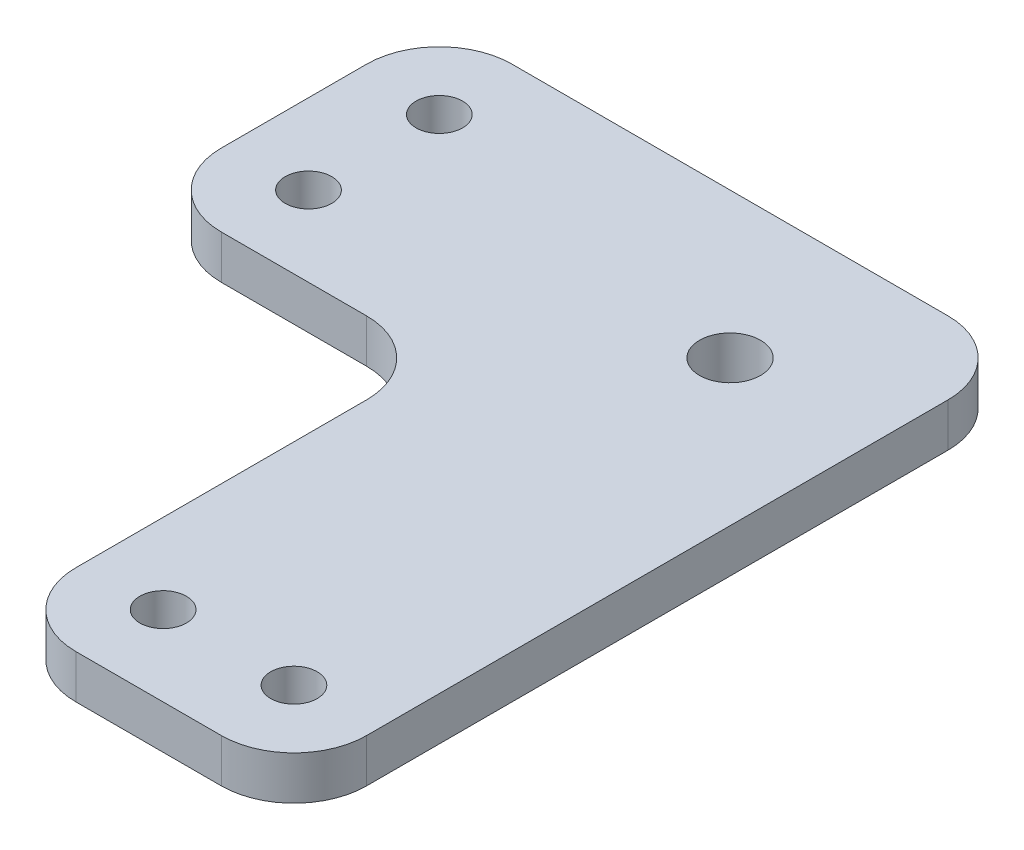
ISO-10303-21;
HEADER;
FILE_DESCRIPTION(('STEP AP214'),'2;1');
FILE_NAME('part.step','',(''),(''),'','','');
FILE_SCHEMA(('AUTOMOTIVE_DESIGN { 1 0 10303 214 1 1 1 1 }'));
ENDSEC;
DATA;
#1=APPLICATION_CONTEXT('core data for automotive mechanical design processes');
#2=APPLICATION_PROTOCOL_DEFINITION('international standard','automotive_design',2000,#1);
#3=PRODUCT_CONTEXT('',#1,'mechanical');
#4=PRODUCT('Part','Part','',(#3));
#5=PRODUCT_RELATED_PRODUCT_CATEGORY('part','',(#4));
#6=PRODUCT_DEFINITION_FORMATION('','',#4);
#7=PRODUCT_DEFINITION_CONTEXT('part definition',#1,'design');
#8=PRODUCT_DEFINITION('design','',#6,#7);
#9=PRODUCT_DEFINITION_SHAPE('','',#8);
#10=(LENGTH_UNIT() NAMED_UNIT(*) SI_UNIT(.MILLI.,.METRE.));
#11=(NAMED_UNIT(*) PLANE_ANGLE_UNIT() SI_UNIT($,.RADIAN.));
#12=(NAMED_UNIT(*) SI_UNIT($,.STERADIAN.) SOLID_ANGLE_UNIT());
#13=UNCERTAINTY_MEASURE_WITH_UNIT(LENGTH_MEASURE(1.E-05),#10,'distance_accuracy_value','');
#14=(GEOMETRIC_REPRESENTATION_CONTEXT(3) GLOBAL_UNCERTAINTY_ASSIGNED_CONTEXT((#13)) GLOBAL_UNIT_ASSIGNED_CONTEXT((#10,
#11,#12)) REPRESENTATION_CONTEXT('',''));
#15=CARTESIAN_POINT('',(0.,0.,0.));
#16=DIRECTION('',(0.,0.,1.));
#17=DIRECTION('',(1.,0.,0.));
#18=AXIS2_PLACEMENT_3D('',#15,#16,#17);
#19=CARTESIAN_POINT('',(10.,3.,15.));
#20=DIRECTION('',(-1.,0.,0.));
#21=DIRECTION('',(0.,0.,1.));
#22=AXIS2_PLACEMENT_3D('',#19,#20,#21);
#23=PLANE('',#22);
#24=DIRECTION('',(0.,0.,-1.));
#25=VECTOR('',#24,1.);
#26=CARTESIAN_POINT('',(10.,0.,15.));
#27=LINE('',#26,#25);
#28=CARTESIAN_POINT('',(10.,0.,10.));
#29=VERTEX_POINT('',#28);
#30=CARTESIAN_POINT('',(10.,0.,-30.));
#31=VERTEX_POINT('',#30);
#32=EDGE_CURVE('E159',#29,#31,#27,.T.);
#33=ORIENTED_EDGE('',*,*,#32,.T.);
#34=DIRECTION('',(0.,-1.,0.));
#35=VECTOR('',#34,1.);
#36=CARTESIAN_POINT('',(10.,3.,-30.));
#37=LINE('',#36,#35);
#38=CARTESIAN_POINT('',(10.,3.,-30.));
#39=VERTEX_POINT('',#38);
#40=EDGE_CURVE('E134',#31,#39,#37,.F.);
#41=ORIENTED_EDGE('',*,*,#40,.T.);
#42=DIRECTION('',(0.,0.,-1.));
#43=VECTOR('',#42,1.);
#44=CARTESIAN_POINT('',(10.,3.,15.));
#45=LINE('',#44,#43);
#46=CARTESIAN_POINT('',(10.,3.,10.));
#47=VERTEX_POINT('',#46);
#48=EDGE_CURVE('E180',#47,#39,#45,.T.);
#49=ORIENTED_EDGE('',*,*,#48,.F.);
#50=DIRECTION('',(0.,-1.,0.));
#51=VECTOR('',#50,1.);
#52=CARTESIAN_POINT('',(10.,3.,10.));
#53=LINE('',#52,#51);
#54=EDGE_CURVE('E140',#47,#29,#53,.T.);
#55=ORIENTED_EDGE('',*,*,#54,.T.);
#56=EDGE_LOOP('',(#33,#41,#49,#55));
#57=FACE_BOUND('',#56,.T.);
#58=ADVANCED_FACE('F38',(#57),#23,.F.);
#59=CARTESIAN_POINT('',(10.,3.,-35.));
#60=DIRECTION('',(0.,0.,1.));
#61=DIRECTION('',(1.,0.,0.));
#62=AXIS2_PLACEMENT_3D('',#59,#60,#61);
#63=PLANE('',#62);
#64=DIRECTION('',(-1.,0.,0.));
#65=VECTOR('',#64,1.);
#66=CARTESIAN_POINT('',(10.,3.,-35.));
#67=LINE('',#66,#65);
#68=CARTESIAN_POINT('',(5.,3.,-35.));
#69=VERTEX_POINT('',#68);
#70=CARTESIAN_POINT('',(-25.,3.,-35.));
#71=VERTEX_POINT('',#70);
#72=EDGE_CURVE('E150',#69,#71,#67,.T.);
#73=ORIENTED_EDGE('',*,*,#72,.F.);
#74=DIRECTION('',(0.,-1.,0.));
#75=VECTOR('',#74,1.);
#76=CARTESIAN_POINT('',(5.,3.,-35.));
#77=LINE('',#76,#75);
#78=CARTESIAN_POINT('',(5.,0.,-35.));
#79=VERTEX_POINT('',#78);
#80=EDGE_CURVE('E133',#69,#79,#77,.T.);
#81=ORIENTED_EDGE('',*,*,#80,.T.);
#82=DIRECTION('',(-1.,0.,0.));
#83=VECTOR('',#82,1.);
#84=CARTESIAN_POINT('',(10.,0.,-35.));
#85=LINE('',#84,#83);
#86=CARTESIAN_POINT('',(-25.,0.,-35.));
#87=VERTEX_POINT('',#86);
#88=EDGE_CURVE('E147',#79,#87,#85,.T.);
#89=ORIENTED_EDGE('',*,*,#88,.T.);
#90=DIRECTION('',(0.,-1.,0.));
#91=VECTOR('',#90,1.);
#92=CARTESIAN_POINT('',(-25.,3.,-35.));
#93=LINE('',#92,#91);
#94=EDGE_CURVE('E153',#87,#71,#93,.F.);
#95=ORIENTED_EDGE('',*,*,#94,.T.);
#96=EDGE_LOOP('',(#73,#81,#89,#95));
#97=FACE_BOUND('',#96,.T.);
#98=ADVANCED_FACE('F146',(#97),#63,.F.);
#99=CARTESIAN_POINT('',(-30.,3.,-35.));
#100=DIRECTION('',(1.,0.,0.));
#101=DIRECTION('',(0.,0.,-1.));
#102=AXIS2_PLACEMENT_3D('',#99,#100,#101);
#103=PLANE('',#102);
#104=DIRECTION('',(0.,0.,1.));
#105=VECTOR('',#104,1.);
#106=CARTESIAN_POINT('',(-30.,3.,-35.));
#107=LINE('',#106,#105);
#108=CARTESIAN_POINT('',(-30.,3.,-30.));
#109=VERTEX_POINT('',#108);
#110=CARTESIAN_POINT('',(-30.,3.,-20.));
#111=VERTEX_POINT('',#110);
#112=EDGE_CURVE('E264',#109,#111,#107,.T.);
#113=ORIENTED_EDGE('',*,*,#112,.F.);
#114=DIRECTION('',(0.,-1.,0.));
#115=VECTOR('',#114,1.);
#116=CARTESIAN_POINT('',(-30.,3.,-30.));
#117=LINE('',#116,#115);
#118=CARTESIAN_POINT('',(-30.,0.,-30.));
#119=VERTEX_POINT('',#118);
#120=EDGE_CURVE('E216',#109,#119,#117,.T.);
#121=ORIENTED_EDGE('',*,*,#120,.T.);
#122=DIRECTION('',(0.,0.,1.));
#123=VECTOR('',#122,1.);
#124=CARTESIAN_POINT('',(-30.,0.,-35.));
#125=LINE('',#124,#123);
#126=CARTESIAN_POINT('',(-30.,0.,-20.));
#127=VERTEX_POINT('',#126);
#128=EDGE_CURVE('E158',#119,#127,#125,.T.);
#129=ORIENTED_EDGE('',*,*,#128,.T.);
#130=DIRECTION('',(0.,-1.,0.));
#131=VECTOR('',#130,1.);
#132=CARTESIAN_POINT('',(-30.,3.,-20.));
#133=LINE('',#132,#131);
#134=EDGE_CURVE('E213',#127,#111,#133,.F.);
#135=ORIENTED_EDGE('',*,*,#134,.T.);
#136=EDGE_LOOP('',(#113,#121,#129,#135));
#137=FACE_BOUND('',#136,.T.);
#138=ADVANCED_FACE('F355',(#137),#103,.F.);
#139=CARTESIAN_POINT('',(-30.,3.,-15.));
#140=DIRECTION('',(0.,0.,-1.));
#141=DIRECTION('',(-1.,0.,0.));
#142=AXIS2_PLACEMENT_3D('',#139,#140,#141);
#143=PLANE('',#142);
#144=DIRECTION('',(1.,0.,0.));
#145=VECTOR('',#144,1.);
#146=CARTESIAN_POINT('',(-30.,0.,-15.));
#147=LINE('',#146,#145);
#148=CARTESIAN_POINT('',(-25.,0.,-15.));
#149=VERTEX_POINT('',#148);
#150=CARTESIAN_POINT('',(-15.,0.,-15.));
#151=VERTEX_POINT('',#150);
#152=EDGE_CURVE('E164',#149,#151,#147,.T.);
#153=ORIENTED_EDGE('',*,*,#152,.T.);
#154=DIRECTION('',(0.,-1.,0.));
#155=VECTOR('',#154,1.);
#156=CARTESIAN_POINT('',(-15.,3.,-15.));
#157=LINE('',#156,#155);
#158=CARTESIAN_POINT('',(-15.,3.,-15.));
#159=VERTEX_POINT('',#158);
#160=EDGE_CURVE('E237',#151,#159,#157,.F.);
#161=ORIENTED_EDGE('',*,*,#160,.T.);
#162=DIRECTION('',(1.,0.,0.));
#163=VECTOR('',#162,1.);
#164=CARTESIAN_POINT('',(-30.,3.,-15.));
#165=LINE('',#164,#163);
#166=CARTESIAN_POINT('',(-25.,3.,-15.));
#167=VERTEX_POINT('',#166);
#168=EDGE_CURVE('E256',#167,#159,#165,.T.);
#169=ORIENTED_EDGE('',*,*,#168,.F.);
#170=DIRECTION('',(0.,-1.,0.));
#171=VECTOR('',#170,1.);
#172=CARTESIAN_POINT('',(-25.,3.,-15.));
#173=LINE('',#172,#171);
#174=EDGE_CURVE('E233',#167,#149,#173,.T.);
#175=ORIENTED_EDGE('',*,*,#174,.T.);
#176=EDGE_LOOP('',(#153,#161,#169,#175));
#177=FACE_BOUND('',#176,.T.);
#178=ADVANCED_FACE('F246',(#177),#143,.F.);
#179=CARTESIAN_POINT('',(-10.,3.,-15.));
#180=DIRECTION('',(1.,0.,0.));
#181=DIRECTION('',(0.,0.,-1.));
#182=AXIS2_PLACEMENT_3D('',#179,#180,#181);
#183=PLANE('',#182);
#184=DIRECTION('',(0.,0.,1.));
#185=VECTOR('',#184,1.);
#186=CARTESIAN_POINT('',(-10.,0.,-15.));
#187=LINE('',#186,#185);
#188=CARTESIAN_POINT('',(-10.,0.,-10.));
#189=VERTEX_POINT('',#188);
#190=CARTESIAN_POINT('',(-10.,0.,10.));
#191=VERTEX_POINT('',#190);
#192=EDGE_CURVE('E173',#189,#191,#187,.T.);
#193=ORIENTED_EDGE('',*,*,#192,.T.);
#194=DIRECTION('',(0.,-1.,0.));
#195=VECTOR('',#194,1.);
#196=CARTESIAN_POINT('',(-10.,3.,10.));
#197=LINE('',#196,#195);
#198=CARTESIAN_POINT('',(-10.,3.,10.));
#199=VERTEX_POINT('',#198);
#200=EDGE_CURVE('E230',#191,#199,#197,.F.);
#201=ORIENTED_EDGE('',*,*,#200,.T.);
#202=DIRECTION('',(0.,0.,1.));
#203=VECTOR('',#202,1.);
#204=CARTESIAN_POINT('',(-10.,3.,-15.));
#205=LINE('',#204,#203);
#206=CARTESIAN_POINT('',(-10.,3.,-10.));
#207=VERTEX_POINT('',#206);
#208=EDGE_CURVE('E255',#207,#199,#205,.T.);
#209=ORIENTED_EDGE('',*,*,#208,.F.);
#210=DIRECTION('',(0.,-1.,0.));
#211=VECTOR('',#210,1.);
#212=CARTESIAN_POINT('',(-10.,0.,-10.));
#213=LINE('',#212,#211);
#214=EDGE_CURVE('E226',#207,#189,#213,.T.);
#215=ORIENTED_EDGE('',*,*,#214,.T.);
#216=EDGE_LOOP('',(#193,#201,#209,#215));
#217=FACE_BOUND('',#216,.T.);
#218=ADVANCED_FACE('F258',(#217),#183,.F.);
#219=CARTESIAN_POINT('',(-10.,3.,15.));
#220=DIRECTION('',(0.,0.,-1.));
#221=DIRECTION('',(-1.,0.,0.));
#222=AXIS2_PLACEMENT_3D('',#219,#220,#221);
#223=PLANE('',#222);
#224=DIRECTION('',(1.,0.,0.));
#225=VECTOR('',#224,1.);
#226=CARTESIAN_POINT('',(-10.,0.,15.));
#227=LINE('',#226,#225);
#228=CARTESIAN_POINT('',(-5.,0.,15.));
#229=VERTEX_POINT('',#228);
#230=CARTESIAN_POINT('',(5.,0.,15.));
#231=VERTEX_POINT('',#230);
#232=EDGE_CURVE('E177',#229,#231,#227,.T.);
#233=ORIENTED_EDGE('',*,*,#232,.T.);
#234=DIRECTION('',(0.,-1.,0.));
#235=VECTOR('',#234,1.);
#236=CARTESIAN_POINT('',(5.,3.,15.));
#237=LINE('',#236,#235);
#238=CARTESIAN_POINT('',(5.,3.,15.));
#239=VERTEX_POINT('',#238);
#240=EDGE_CURVE('E54',#231,#239,#237,.F.);
#241=ORIENTED_EDGE('',*,*,#240,.T.);
#242=DIRECTION('',(1.,0.,0.));
#243=VECTOR('',#242,1.);
#244=CARTESIAN_POINT('',(-10.,3.,15.));
#245=LINE('',#244,#243);
#246=CARTESIAN_POINT('',(-5.,3.,15.));
#247=VERTEX_POINT('',#246);
#248=EDGE_CURVE('E182',#247,#239,#245,.T.);
#249=ORIENTED_EDGE('',*,*,#248,.F.);
#250=DIRECTION('',(0.,-1.,0.));
#251=VECTOR('',#250,1.);
#252=CARTESIAN_POINT('',(-5.,3.,15.));
#253=LINE('',#252,#251);
#254=EDGE_CURVE('E220',#247,#229,#253,.T.);
#255=ORIENTED_EDGE('',*,*,#254,.T.);
#256=EDGE_LOOP('',(#233,#241,#249,#255));
#257=FACE_BOUND('',#256,.T.);
#258=ADVANCED_FACE('F324',(#257),#223,.F.);
#259=CARTESIAN_POINT('',(0.,3.,0.));
#260=DIRECTION('',(0.,1.,0.));
#261=DIRECTION('',(0.,0.,1.));
#262=AXIS2_PLACEMENT_3D('',#259,#260,#261);
#263=PLANE('',#262);
#264=CARTESIAN_POINT('',(0.,3.,-25.));
#265=DIRECTION('',(0.,1.,0.));
#266=DIRECTION('',(0.,0.,1.));
#267=AXIS2_PLACEMENT_3D('',#264,#265,#266);
#268=CIRCLE('',#267,2.1);
#269=CARTESIAN_POINT('',(0.,3.,-22.9));
#270=VERTEX_POINT('',#269);
#271=EDGE_CURVE('E306',#270,#270,#268,.T.);
#272=ORIENTED_EDGE('',*,*,#271,.F.);
#273=EDGE_LOOP('',(#272));
#274=FACE_BOUND('',#273,.T.);
#275=CARTESIAN_POINT('',(-24.5,3.,-29.5));
#276=DIRECTION('',(0.,1.,0.));
#277=DIRECTION('',(0.,0.,1.));
#278=AXIS2_PLACEMENT_3D('',#275,#276,#277);
#279=CIRCLE('',#278,1.6);
#280=CARTESIAN_POINT('',(-24.5,3.,-27.9));
#281=VERTEX_POINT('',#280);
#282=EDGE_CURVE('E291',#281,#281,#279,.T.);
#283=ORIENTED_EDGE('',*,*,#282,.F.);
#284=EDGE_LOOP('',(#283));
#285=FACE_BOUND('',#284,.T.);
#286=CARTESIAN_POINT('',(-4.5,3.,9.5));
#287=DIRECTION('',(0.,1.,0.));
#288=DIRECTION('',(0.,0.,1.));
#289=AXIS2_PLACEMENT_3D('',#286,#287,#288);
#290=CIRCLE('',#289,1.6);
#291=CARTESIAN_POINT('',(-4.5,3.,11.1));
#292=VERTEX_POINT('',#291);
#293=EDGE_CURVE('E292',#292,#292,#290,.T.);
#294=ORIENTED_EDGE('',*,*,#293,.F.);
#295=EDGE_LOOP('',(#294));
#296=FACE_BOUND('',#295,.T.);
#297=CARTESIAN_POINT('',(4.5,3.,9.5));
#298=DIRECTION('',(0.,1.,0.));
#299=DIRECTION('',(0.,0.,1.));
#300=AXIS2_PLACEMENT_3D('',#297,#298,#299);
#301=CIRCLE('',#300,1.6);
#302=CARTESIAN_POINT('',(4.5,3.,11.1));
#303=VERTEX_POINT('',#302);
#304=EDGE_CURVE('E274',#303,#303,#301,.T.);
#305=ORIENTED_EDGE('',*,*,#304,.F.);
#306=EDGE_LOOP('',(#305));
#307=FACE_BOUND('',#306,.T.);
#308=CARTESIAN_POINT('',(-24.5,3.,-20.5));
#309=DIRECTION('',(0.,1.,0.));
#310=DIRECTION('',(0.,0.,1.));
#311=AXIS2_PLACEMENT_3D('',#308,#309,#310);
#312=CIRCLE('',#311,1.6);
#313=CARTESIAN_POINT('',(-24.5,3.,-18.9));
#314=VERTEX_POINT('',#313);
#315=EDGE_CURVE('E283',#314,#314,#312,.T.);
#316=ORIENTED_EDGE('',*,*,#315,.F.);
#317=EDGE_LOOP('',(#316));
#318=FACE_BOUND('',#317,.T.);
#319=ORIENTED_EDGE('',*,*,#48,.T.);
#320=CARTESIAN_POINT('',(5.00000000000001,3.,-30.));
#321=DIRECTION('',(0.,1.,0.));
#322=DIRECTION('',(0.,0.,1.));
#323=AXIS2_PLACEMENT_3D('',#320,#321,#322);
#324=CIRCLE('',#323,5.);
#325=EDGE_CURVE('E210',#39,#69,#324,.T.);
#326=ORIENTED_EDGE('',*,*,#325,.T.);
#327=ORIENTED_EDGE('',*,*,#72,.T.);
#328=CARTESIAN_POINT('',(-25.,3.,-30.));
#329=DIRECTION('',(0.,1.,0.));
#330=DIRECTION('',(0.,0.,1.));
#331=AXIS2_PLACEMENT_3D('',#328,#329,#330);
#332=CIRCLE('',#331,5.);
#333=EDGE_CURVE('E207',#71,#109,#332,.T.);
#334=ORIENTED_EDGE('',*,*,#333,.T.);
#335=ORIENTED_EDGE('',*,*,#112,.T.);
#336=CARTESIAN_POINT('',(-25.,3.,-20.));
#337=DIRECTION('',(0.,1.,0.));
#338=DIRECTION('',(0.,0.,1.));
#339=AXIS2_PLACEMENT_3D('',#336,#337,#338);
#340=CIRCLE('',#339,5.);
#341=EDGE_CURVE('E199',#111,#167,#340,.T.);
#342=ORIENTED_EDGE('',*,*,#341,.T.);
#343=ORIENTED_EDGE('',*,*,#168,.T.);
#344=CARTESIAN_POINT('',(-15.,3.,-10.));
#345=DIRECTION('',(0.,1.,0.));
#346=DIRECTION('',(0.,0.,1.));
#347=AXIS2_PLACEMENT_3D('',#344,#345,#346);
#348=CIRCLE('',#347,5.);
#349=EDGE_CURVE('E11',#159,#207,#348,.F.);
#350=ORIENTED_EDGE('',*,*,#349,.T.);
#351=ORIENTED_EDGE('',*,*,#208,.T.);
#352=CARTESIAN_POINT('',(-5.,3.,10.));
#353=DIRECTION('',(0.,1.,0.));
#354=DIRECTION('',(0.,0.,1.));
#355=AXIS2_PLACEMENT_3D('',#352,#353,#354);
#356=CIRCLE('',#355,5.);
#357=EDGE_CURVE('E61',#199,#247,#356,.T.);
#358=ORIENTED_EDGE('',*,*,#357,.T.);
#359=ORIENTED_EDGE('',*,*,#248,.T.);
#360=CARTESIAN_POINT('',(5.,3.,10.));
#361=DIRECTION('',(0.,1.,0.));
#362=DIRECTION('',(0.,0.,1.));
#363=AXIS2_PLACEMENT_3D('',#360,#361,#362);
#364=CIRCLE('',#363,5.);
#365=EDGE_CURVE('E204',#239,#47,#364,.T.);
#366=ORIENTED_EDGE('',*,*,#365,.T.);
#367=EDGE_LOOP('',(#319,#326,#327,#334,#335,#342,#343,#350,#351,#358,#359,#366));
#368=FACE_BOUND('',#367,.T.);
#369=ADVANCED_FACE('F254',(#274,#285,#296,#307,#318,#368),#263,.T.);
#370=CARTESIAN_POINT('',(0.,0.,0.));
#371=DIRECTION('',(0.,1.,0.));
#372=DIRECTION('',(0.,0.,1.));
#373=AXIS2_PLACEMENT_3D('',#370,#371,#372);
#374=PLANE('',#373);
#375=CARTESIAN_POINT('',(0.,0.,-25.));
#376=DIRECTION('',(0.,1.,0.));
#377=DIRECTION('',(0.,0.,1.));
#378=AXIS2_PLACEMENT_3D('',#375,#376,#377);
#379=CIRCLE('',#378,2.1);
#380=CARTESIAN_POINT('',(0.,0.,-22.9));
#381=VERTEX_POINT('',#380);
#382=EDGE_CURVE('E296',#381,#381,#379,.T.);
#383=ORIENTED_EDGE('',*,*,#382,.T.);
#384=EDGE_LOOP('',(#383));
#385=FACE_BOUND('',#384,.T.);
#386=CARTESIAN_POINT('',(-24.5,0.,-29.5));
#387=DIRECTION('',(0.,1.,0.));
#388=DIRECTION('',(0.,0.,1.));
#389=AXIS2_PLACEMENT_3D('',#386,#387,#388);
#390=CIRCLE('',#389,1.6);
#391=CARTESIAN_POINT('',(-24.5,0.,-27.9));
#392=VERTEX_POINT('',#391);
#393=EDGE_CURVE('E166',#392,#392,#390,.T.);
#394=ORIENTED_EDGE('',*,*,#393,.T.);
#395=EDGE_LOOP('',(#394));
#396=FACE_BOUND('',#395,.T.);
#397=CARTESIAN_POINT('',(-4.5,0.,9.5));
#398=DIRECTION('',(0.,1.,0.));
#399=DIRECTION('',(0.,0.,1.));
#400=AXIS2_PLACEMENT_3D('',#397,#398,#399);
#401=CIRCLE('',#400,1.6);
#402=CARTESIAN_POINT('',(-4.5,0.,11.1));
#403=VERTEX_POINT('',#402);
#404=EDGE_CURVE('E279',#403,#403,#401,.T.);
#405=ORIENTED_EDGE('',*,*,#404,.T.);
#406=EDGE_LOOP('',(#405));
#407=FACE_BOUND('',#406,.T.);
#408=CARTESIAN_POINT('',(4.5,0.,9.5));
#409=DIRECTION('',(0.,1.,0.));
#410=DIRECTION('',(0.,0.,1.));
#411=AXIS2_PLACEMENT_3D('',#408,#409,#410);
#412=CIRCLE('',#411,1.6);
#413=CARTESIAN_POINT('',(4.5,0.,11.1));
#414=VERTEX_POINT('',#413);
#415=EDGE_CURVE('E278',#414,#414,#412,.T.);
#416=ORIENTED_EDGE('',*,*,#415,.T.);
#417=EDGE_LOOP('',(#416));
#418=FACE_BOUND('',#417,.T.);
#419=CARTESIAN_POINT('',(-24.5,0.,-20.5));
#420=DIRECTION('',(0.,1.,0.));
#421=DIRECTION('',(0.,0.,1.));
#422=AXIS2_PLACEMENT_3D('',#419,#420,#421);
#423=CIRCLE('',#422,1.6);
#424=CARTESIAN_POINT('',(-24.5,0.,-18.9));
#425=VERTEX_POINT('',#424);
#426=EDGE_CURVE('E287',#425,#425,#423,.T.);
#427=ORIENTED_EDGE('',*,*,#426,.T.);
#428=EDGE_LOOP('',(#427));
#429=FACE_BOUND('',#428,.T.);
#430=ORIENTED_EDGE('',*,*,#88,.F.);
#431=CARTESIAN_POINT('',(5.00000000000001,0.,-30.));
#432=DIRECTION('',(0.,1.,0.));
#433=DIRECTION('',(0.,0.,1.));
#434=AXIS2_PLACEMENT_3D('',#431,#432,#433);
#435=CIRCLE('',#434,5.);
#436=EDGE_CURVE('E129',#79,#31,#435,.F.);
#437=ORIENTED_EDGE('',*,*,#436,.T.);
#438=ORIENTED_EDGE('',*,*,#32,.F.);
#439=CARTESIAN_POINT('',(5.,0.,10.));
#440=DIRECTION('',(0.,1.,0.));
#441=DIRECTION('',(0.,0.,1.));
#442=AXIS2_PLACEMENT_3D('',#439,#440,#441);
#443=CIRCLE('',#442,5.);
#444=EDGE_CURVE('E189',#29,#231,#443,.F.);
#445=ORIENTED_EDGE('',*,*,#444,.T.);
#446=ORIENTED_EDGE('',*,*,#232,.F.);
#447=CARTESIAN_POINT('',(-5.,0.,10.));
#448=DIRECTION('',(0.,1.,0.));
#449=DIRECTION('',(0.,0.,1.));
#450=AXIS2_PLACEMENT_3D('',#447,#448,#449);
#451=CIRCLE('',#450,5.);
#452=EDGE_CURVE('E186',#229,#191,#451,.F.);
#453=ORIENTED_EDGE('',*,*,#452,.T.);
#454=ORIENTED_EDGE('',*,*,#192,.F.);
#455=CARTESIAN_POINT('',(-15.,0.,-10.));
#456=DIRECTION('',(0.,1.,0.));
#457=DIRECTION('',(0.,0.,1.));
#458=AXIS2_PLACEMENT_3D('',#455,#456,#457);
#459=CIRCLE('',#458,5.);
#460=EDGE_CURVE('E47',#189,#151,#459,.T.);
#461=ORIENTED_EDGE('',*,*,#460,.T.);
#462=ORIENTED_EDGE('',*,*,#152,.F.);
#463=CARTESIAN_POINT('',(-25.,0.,-20.));
#464=DIRECTION('',(0.,1.,0.));
#465=DIRECTION('',(0.,0.,1.));
#466=AXIS2_PLACEMENT_3D('',#463,#464,#465);
#467=CIRCLE('',#466,5.);
#468=EDGE_CURVE('E152',#149,#127,#467,.F.);
#469=ORIENTED_EDGE('',*,*,#468,.T.);
#470=ORIENTED_EDGE('',*,*,#128,.F.);
#471=CARTESIAN_POINT('',(-25.,0.,-30.));
#472=DIRECTION('',(0.,1.,0.));
#473=DIRECTION('',(0.,0.,1.));
#474=AXIS2_PLACEMENT_3D('',#471,#472,#473);
#475=CIRCLE('',#474,5.);
#476=EDGE_CURVE('E141',#119,#87,#475,.F.);
#477=ORIENTED_EDGE('',*,*,#476,.T.);
#478=EDGE_LOOP('',(#430,#437,#438,#445,#446,#453,#454,#461,#462,#469,#470,#477));
#479=FACE_BOUND('',#478,.T.);
#480=ADVANCED_FACE('F155',(#385,#396,#407,#418,#429,#479),#374,.F.);
#481=CARTESIAN_POINT('',(-24.5,0.,-20.5));
#482=DIRECTION('',(0.,1.,0.));
#483=DIRECTION('',(0.,0.,1.));
#484=AXIS2_PLACEMENT_3D('',#481,#482,#483);
#485=CYLINDRICAL_SURFACE('',#484,1.6);
#486=ORIENTED_EDGE('',*,*,#426,.F.);
#487=EDGE_LOOP('',(#486));
#488=FACE_BOUND('',#487,.T.);
#489=ORIENTED_EDGE('',*,*,#315,.T.);
#490=EDGE_LOOP('',(#489));
#491=FACE_BOUND('',#490,.T.);
#492=ADVANCED_FACE('F334',(#488,#491),#485,.F.);
#493=CARTESIAN_POINT('',(4.5,0.,9.5));
#494=DIRECTION('',(0.,1.,0.));
#495=DIRECTION('',(0.,0.,1.));
#496=AXIS2_PLACEMENT_3D('',#493,#494,#495);
#497=CYLINDRICAL_SURFACE('',#496,1.6);
#498=ORIENTED_EDGE('',*,*,#415,.F.);
#499=EDGE_LOOP('',(#498));
#500=FACE_BOUND('',#499,.T.);
#501=ORIENTED_EDGE('',*,*,#304,.T.);
#502=EDGE_LOOP('',(#501));
#503=FACE_BOUND('',#502,.T.);
#504=ADVANCED_FACE('F336',(#500,#503),#497,.F.);
#505=CARTESIAN_POINT('',(-4.5,0.,9.5));
#506=DIRECTION('',(0.,1.,0.));
#507=DIRECTION('',(0.,0.,1.));
#508=AXIS2_PLACEMENT_3D('',#505,#506,#507);
#509=CYLINDRICAL_SURFACE('',#508,1.6);
#510=ORIENTED_EDGE('',*,*,#404,.F.);
#511=EDGE_LOOP('',(#510));
#512=FACE_BOUND('',#511,.T.);
#513=ORIENTED_EDGE('',*,*,#293,.T.);
#514=EDGE_LOOP('',(#513));
#515=FACE_BOUND('',#514,.T.);
#516=ADVANCED_FACE('F343',(#512,#515),#509,.F.);
#517=CARTESIAN_POINT('',(-24.5,0.,-29.5));
#518=DIRECTION('',(0.,1.,0.));
#519=DIRECTION('',(0.,0.,1.));
#520=AXIS2_PLACEMENT_3D('',#517,#518,#519);
#521=CYLINDRICAL_SURFACE('',#520,1.6);
#522=ORIENTED_EDGE('',*,*,#393,.F.);
#523=EDGE_LOOP('',(#522));
#524=FACE_BOUND('',#523,.T.);
#525=ORIENTED_EDGE('',*,*,#282,.T.);
#526=EDGE_LOOP('',(#525));
#527=FACE_BOUND('',#526,.T.);
#528=ADVANCED_FACE('F362',(#524,#527),#521,.F.);
#529=CARTESIAN_POINT('',(5.00000000000001,3.,-30.));
#530=DIRECTION('',(0.,-1.,0.));
#531=DIRECTION('',(0.,0.,-1.));
#532=AXIS2_PLACEMENT_3D('',#529,#530,#531);
#533=CYLINDRICAL_SURFACE('',#532,5.);
#534=ORIENTED_EDGE('',*,*,#325,.F.);
#535=ORIENTED_EDGE('',*,*,#40,.F.);
#536=ORIENTED_EDGE('',*,*,#436,.F.);
#537=ORIENTED_EDGE('',*,*,#80,.F.);
#538=EDGE_LOOP('',(#534,#535,#536,#537));
#539=FACE_BOUND('',#538,.T.);
#540=ADVANCED_FACE('F132',(#539),#533,.T.);
#541=CARTESIAN_POINT('',(-25.,3.,-30.));
#542=DIRECTION('',(0.,-1.,0.));
#543=DIRECTION('',(0.,0.,-1.));
#544=AXIS2_PLACEMENT_3D('',#541,#542,#543);
#545=CYLINDRICAL_SURFACE('',#544,5.);
#546=ORIENTED_EDGE('',*,*,#333,.F.);
#547=ORIENTED_EDGE('',*,*,#94,.F.);
#548=ORIENTED_EDGE('',*,*,#476,.F.);
#549=ORIENTED_EDGE('',*,*,#120,.F.);
#550=EDGE_LOOP('',(#546,#547,#548,#549));
#551=FACE_BOUND('',#550,.T.);
#552=ADVANCED_FACE('F361',(#551),#545,.T.);
#553=CARTESIAN_POINT('',(5.,3.,10.));
#554=DIRECTION('',(0.,-1.,0.));
#555=DIRECTION('',(0.,0.,-1.));
#556=AXIS2_PLACEMENT_3D('',#553,#554,#555);
#557=CYLINDRICAL_SURFACE('',#556,5.);
#558=ORIENTED_EDGE('',*,*,#365,.F.);
#559=ORIENTED_EDGE('',*,*,#240,.F.);
#560=ORIENTED_EDGE('',*,*,#444,.F.);
#561=ORIENTED_EDGE('',*,*,#54,.F.);
#562=EDGE_LOOP('',(#558,#559,#560,#561));
#563=FACE_BOUND('',#562,.T.);
#564=ADVANCED_FACE('F365',(#563),#557,.T.);
#565=CARTESIAN_POINT('',(-5.,3.,10.));
#566=DIRECTION('',(0.,-1.,0.));
#567=DIRECTION('',(0.,0.,-1.));
#568=AXIS2_PLACEMENT_3D('',#565,#566,#567);
#569=CYLINDRICAL_SURFACE('',#568,5.);
#570=ORIENTED_EDGE('',*,*,#357,.F.);
#571=ORIENTED_EDGE('',*,*,#200,.F.);
#572=ORIENTED_EDGE('',*,*,#452,.F.);
#573=ORIENTED_EDGE('',*,*,#254,.F.);
#574=EDGE_LOOP('',(#570,#571,#572,#573));
#575=FACE_BOUND('',#574,.T.);
#576=ADVANCED_FACE('F369',(#575),#569,.T.);
#577=CARTESIAN_POINT('',(-15.,3.,-10.));
#578=DIRECTION('',(0.,1.,0.));
#579=DIRECTION('',(0.,0.,1.));
#580=AXIS2_PLACEMENT_3D('',#577,#578,#579);
#581=CYLINDRICAL_SURFACE('',#580,5.);
#582=ORIENTED_EDGE('',*,*,#349,.F.);
#583=ORIENTED_EDGE('',*,*,#160,.F.);
#584=ORIENTED_EDGE('',*,*,#460,.F.);
#585=ORIENTED_EDGE('',*,*,#214,.F.);
#586=EDGE_LOOP('',(#582,#583,#584,#585));
#587=FACE_BOUND('',#586,.T.);
#588=ADVANCED_FACE('F251',(#587),#581,.F.);
#589=CARTESIAN_POINT('',(-25.,3.,-20.));
#590=DIRECTION('',(0.,-1.,0.));
#591=DIRECTION('',(0.,0.,-1.));
#592=AXIS2_PLACEMENT_3D('',#589,#590,#591);
#593=CYLINDRICAL_SURFACE('',#592,5.);
#594=ORIENTED_EDGE('',*,*,#341,.F.);
#595=ORIENTED_EDGE('',*,*,#134,.F.);
#596=ORIENTED_EDGE('',*,*,#468,.F.);
#597=ORIENTED_EDGE('',*,*,#174,.F.);
#598=EDGE_LOOP('',(#594,#595,#596,#597));
#599=FACE_BOUND('',#598,.T.);
#600=ADVANCED_FACE('F40',(#599),#593,.T.);
#601=CARTESIAN_POINT('',(0.,0.,-25.));
#602=DIRECTION('',(0.,1.,0.));
#603=DIRECTION('',(0.,0.,1.));
#604=AXIS2_PLACEMENT_3D('',#601,#602,#603);
#605=CYLINDRICAL_SURFACE('',#604,2.1);
#606=ORIENTED_EDGE('',*,*,#382,.F.);
#607=EDGE_LOOP('',(#606));
#608=FACE_BOUND('',#607,.T.);
#609=ORIENTED_EDGE('',*,*,#271,.T.);
#610=EDGE_LOOP('',(#609));
#611=FACE_BOUND('',#610,.T.);
#612=ADVANCED_FACE('F316',(#608,#611),#605,.F.);
#613=CLOSED_SHELL('',(#58,#98,#138,#178,#218,#258,#369,#480,#492,#504,#516,#528,#540,#552,#564,
#576,#588,#600,#612));
#614=MANIFOLD_SOLID_BREP('B2',#613);
#615=ADVANCED_BREP_SHAPE_REPRESENTATION('',(#18,#614),#14);
#616=SHAPE_DEFINITION_REPRESENTATION(#9,#615);
ENDSEC;
END-ISO-10303-21;
